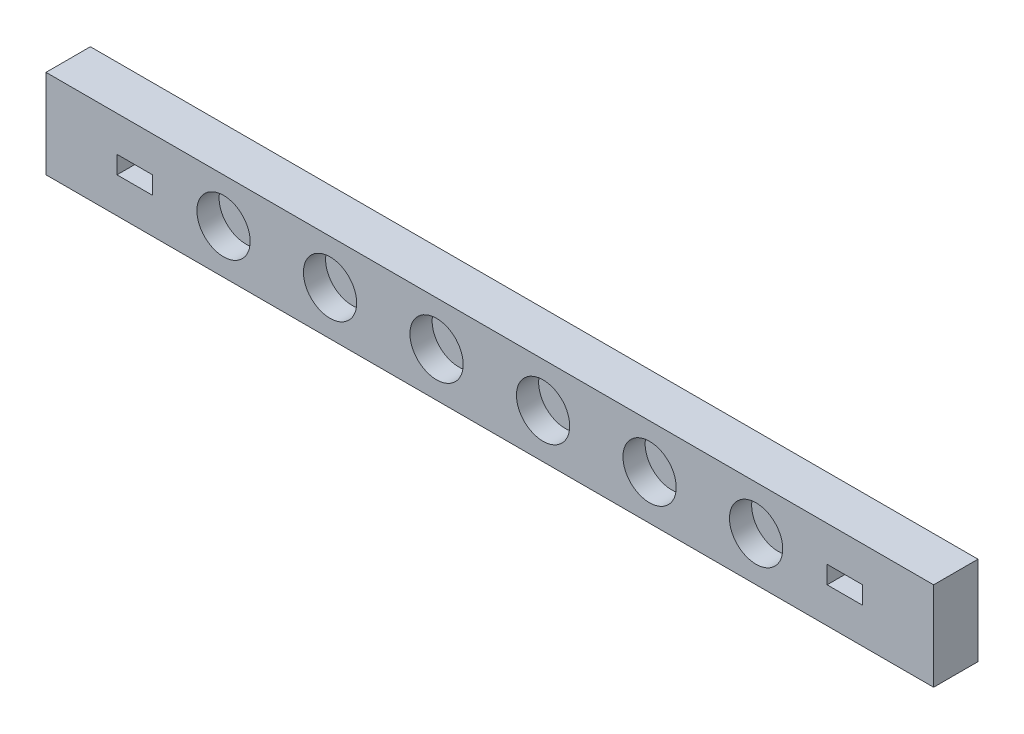
ISO-10303-21;
HEADER;
FILE_DESCRIPTION(('STEP AP214'),'2;1');
FILE_NAME('part.step','',(''),(''),'','','');
FILE_SCHEMA(('AUTOMOTIVE_DESIGN { 1 0 10303 214 1 1 1 1 }'));
ENDSEC;
DATA;
#1=APPLICATION_CONTEXT('core data for automotive mechanical design processes');
#2=APPLICATION_PROTOCOL_DEFINITION('international standard','automotive_design',2000,#1);
#3=PRODUCT_CONTEXT('',#1,'mechanical');
#4=PRODUCT('Part','Part','',(#3));
#5=PRODUCT_RELATED_PRODUCT_CATEGORY('part','',(#4));
#6=PRODUCT_DEFINITION_FORMATION('','',#4);
#7=PRODUCT_DEFINITION_CONTEXT('part definition',#1,'design');
#8=PRODUCT_DEFINITION('design','',#6,#7);
#9=PRODUCT_DEFINITION_SHAPE('','',#8);
#10=(LENGTH_UNIT() NAMED_UNIT(*) SI_UNIT(.MILLI.,.METRE.));
#11=(NAMED_UNIT(*) PLANE_ANGLE_UNIT() SI_UNIT($,.RADIAN.));
#12=(NAMED_UNIT(*) SI_UNIT($,.STERADIAN.) SOLID_ANGLE_UNIT());
#13=UNCERTAINTY_MEASURE_WITH_UNIT(LENGTH_MEASURE(1.E-05),#10,'distance_accuracy_value','');
#14=(GEOMETRIC_REPRESENTATION_CONTEXT(3) GLOBAL_UNCERTAINTY_ASSIGNED_CONTEXT((#13)) GLOBAL_UNIT_ASSIGNED_CONTEXT((#10,
#11,#12)) REPRESENTATION_CONTEXT('',''));
#15=CARTESIAN_POINT('',(0.,0.,0.));
#16=DIRECTION('',(0.,0.,1.));
#17=DIRECTION('',(1.,0.,0.));
#18=AXIS2_PLACEMENT_3D('',#15,#16,#17);
#19=CARTESIAN_POINT('',(0.,0.,50.));
#20=DIRECTION('',(0.,0.,1.));
#21=DIRECTION('',(1.,0.,0.));
#22=AXIS2_PLACEMENT_3D('',#19,#20,#21);
#23=PLANE('',#22);
#24=CARTESIAN_POINT('',(-180.,0.,50.));
#25=DIRECTION('',(0.,0.,1.));
#26=DIRECTION('',(1.,0.,0.));
#27=AXIS2_PLACEMENT_3D('',#24,#25,#26);
#28=CIRCLE('',#27,30.0000000000001);
#29=CARTESIAN_POINT('',(-150.,0.,50.));
#30=VERTEX_POINT('',#29);
#31=EDGE_CURVE('E223',#30,#30,#28,.T.);
#32=ORIENTED_EDGE('',*,*,#31,.F.);
#33=EDGE_LOOP('',(#32));
#34=FACE_BOUND('',#33,.T.);
#35=CARTESIAN_POINT('',(-60.0000000000002,0.,50.));
#36=DIRECTION('',(0.,0.,1.));
#37=DIRECTION('',(1.,0.,0.));
#38=AXIS2_PLACEMENT_3D('',#35,#36,#37);
#39=CIRCLE('',#38,30.0000000000001);
#40=CARTESIAN_POINT('',(-30.0000000000001,0.,50.));
#41=VERTEX_POINT('',#40);
#42=EDGE_CURVE('E230',#41,#41,#39,.T.);
#43=ORIENTED_EDGE('',*,*,#42,.F.);
#44=EDGE_LOOP('',(#43));
#45=FACE_BOUND('',#44,.T.);
#46=CARTESIAN_POINT('',(59.9999999999998,0.,50.));
#47=DIRECTION('',(0.,0.,1.));
#48=DIRECTION('',(1.,0.,0.));
#49=AXIS2_PLACEMENT_3D('',#46,#47,#48);
#50=CIRCLE('',#49,30.0000000000001);
#51=CARTESIAN_POINT('',(89.9999999999999,0.,50.));
#52=VERTEX_POINT('',#51);
#53=EDGE_CURVE('E236',#52,#52,#50,.T.);
#54=ORIENTED_EDGE('',*,*,#53,.F.);
#55=EDGE_LOOP('',(#54));
#56=FACE_BOUND('',#55,.T.);
#57=CARTESIAN_POINT('',(180.,0.,50.));
#58=DIRECTION('',(0.,0.,1.));
#59=DIRECTION('',(1.,0.,0.));
#60=AXIS2_PLACEMENT_3D('',#57,#58,#59);
#61=CIRCLE('',#60,30.0000000000001);
#62=CARTESIAN_POINT('',(210.,0.,50.));
#63=VERTEX_POINT('',#62);
#64=EDGE_CURVE('E242',#63,#63,#61,.T.);
#65=ORIENTED_EDGE('',*,*,#64,.F.);
#66=EDGE_LOOP('',(#65));
#67=FACE_BOUND('',#66,.T.);
#68=CARTESIAN_POINT('',(300.,0.,50.));
#69=DIRECTION('',(0.,0.,1.));
#70=DIRECTION('',(1.,0.,0.));
#71=AXIS2_PLACEMENT_3D('',#68,#69,#70);
#72=CIRCLE('',#71,30.);
#73=CARTESIAN_POINT('',(330.,0.,50.));
#74=VERTEX_POINT('',#73);
#75=EDGE_CURVE('E161',#74,#74,#72,.T.);
#76=ORIENTED_EDGE('',*,*,#75,.F.);
#77=EDGE_LOOP('',(#76));
#78=FACE_BOUND('',#77,.T.);
#79=DIRECTION('',(1.,0.,0.));
#80=VECTOR('',#79,1.);
#81=CARTESIAN_POINT('',(-420.,-9.9999999999999,50.));
#82=LINE('',#81,#80);
#83=CARTESIAN_POINT('',(-420.,-9.9999999999999,50.));
#84=VERTEX_POINT('',#83);
#85=CARTESIAN_POINT('',(-380.,-9.9999999999999,50.));
#86=VERTEX_POINT('',#85);
#87=EDGE_CURVE('E58',#84,#86,#82,.T.);
#88=ORIENTED_EDGE('',*,*,#87,.F.);
#89=DIRECTION('',(0.,-1.,0.));
#90=VECTOR('',#89,1.);
#91=CARTESIAN_POINT('',(-420.,10.0000000000001,50.));
#92=LINE('',#91,#90);
#93=CARTESIAN_POINT('',(-420.,10.0000000000001,50.));
#94=VERTEX_POINT('',#93);
#95=EDGE_CURVE('E204',#94,#84,#92,.T.);
#96=ORIENTED_EDGE('',*,*,#95,.F.);
#97=DIRECTION('',(1.,0.,0.));
#98=VECTOR('',#97,1.);
#99=CARTESIAN_POINT('',(-420.,10.0000000000001,50.));
#100=LINE('',#99,#98);
#101=CARTESIAN_POINT('',(-380.,10.0000000000001,50.));
#102=VERTEX_POINT('',#101);
#103=EDGE_CURVE('E207',#94,#102,#100,.T.);
#104=ORIENTED_EDGE('',*,*,#103,.T.);
#105=DIRECTION('',(0.,-1.,0.));
#106=VECTOR('',#105,1.);
#107=CARTESIAN_POINT('',(-380.,10.0000000000001,50.));
#108=LINE('',#107,#106);
#109=EDGE_CURVE('E211',#102,#86,#108,.T.);
#110=ORIENTED_EDGE('',*,*,#109,.T.);
#111=EDGE_LOOP('',(#88,#96,#104,#110));
#112=FACE_BOUND('',#111,.T.);
#113=CARTESIAN_POINT('',(-300.,0.,50.));
#114=DIRECTION('',(0.,0.,1.));
#115=DIRECTION('',(1.,0.,0.));
#116=AXIS2_PLACEMENT_3D('',#113,#114,#115);
#117=CIRCLE('',#116,30.);
#118=CARTESIAN_POINT('',(-270.,0.,50.));
#119=VERTEX_POINT('',#118);
#120=EDGE_CURVE('E226',#119,#119,#117,.T.);
#121=ORIENTED_EDGE('',*,*,#120,.F.);
#122=EDGE_LOOP('',(#121));
#123=FACE_BOUND('',#122,.T.);
#124=DIRECTION('',(1.,0.,0.));
#125=VECTOR('',#124,1.);
#126=CARTESIAN_POINT('',(-450.,-50.,50.));
#127=LINE('',#126,#125);
#128=CARTESIAN_POINT('',(-500.,-50.,50.));
#129=VERTEX_POINT('',#128);
#130=CARTESIAN_POINT('',(500.,-50.,50.));
#131=VERTEX_POINT('',#130);
#132=EDGE_CURVE('E11',#129,#131,#127,.T.);
#133=ORIENTED_EDGE('',*,*,#132,.T.);
#134=DIRECTION('',(0.,1.,0.));
#135=VECTOR('',#134,1.);
#136=CARTESIAN_POINT('',(500.,-50.,50.));
#137=LINE('',#136,#135);
#138=CARTESIAN_POINT('',(500.,50.,50.));
#139=VERTEX_POINT('',#138);
#140=EDGE_CURVE('E154',#131,#139,#137,.T.);
#141=ORIENTED_EDGE('',*,*,#140,.T.);
#142=DIRECTION('',(-1.,0.,0.));
#143=VECTOR('',#142,1.);
#144=CARTESIAN_POINT('',(-450.,50.,50.));
#145=LINE('',#144,#143);
#146=CARTESIAN_POINT('',(-500.,50.,50.));
#147=VERTEX_POINT('',#146);
#148=EDGE_CURVE('E42',#139,#147,#145,.T.);
#149=ORIENTED_EDGE('',*,*,#148,.T.);
#150=DIRECTION('',(0.,1.,0.));
#151=VECTOR('',#150,1.);
#152=CARTESIAN_POINT('',(-500.,-50.,50.));
#153=LINE('',#152,#151);
#154=EDGE_CURVE('E143',#129,#147,#153,.T.);
#155=ORIENTED_EDGE('',*,*,#154,.F.);
#156=EDGE_LOOP('',(#133,#141,#149,#155));
#157=FACE_BOUND('',#156,.T.);
#158=DIRECTION('',(0.,-1.,0.));
#159=VECTOR('',#158,1.);
#160=CARTESIAN_POINT('',(420.,0.,50.));
#161=LINE('',#160,#159);
#162=CARTESIAN_POINT('',(420.,10.0000000000002,50.));
#163=VERTEX_POINT('',#162);
#164=CARTESIAN_POINT('',(420.,-9.9999999999998,50.));
#165=VERTEX_POINT('',#164);
#166=EDGE_CURVE('E184',#163,#165,#161,.T.);
#167=ORIENTED_EDGE('',*,*,#166,.T.);
#168=DIRECTION('',(-1.,0.,0.));
#169=VECTOR('',#168,1.);
#170=CARTESIAN_POINT('',(0.,-9.99999999999989,50.));
#171=LINE('',#170,#169);
#172=CARTESIAN_POINT('',(380.,-9.9999999999998,50.));
#173=VERTEX_POINT('',#172);
#174=EDGE_CURVE('E50',#165,#173,#171,.T.);
#175=ORIENTED_EDGE('',*,*,#174,.T.);
#176=DIRECTION('',(0.,-1.,0.));
#177=VECTOR('',#176,1.);
#178=CARTESIAN_POINT('',(380.,0.,50.));
#179=LINE('',#178,#177);
#180=CARTESIAN_POINT('',(380.,10.0000000000002,50.));
#181=VERTEX_POINT('',#180);
#182=EDGE_CURVE('E177',#181,#173,#179,.T.);
#183=ORIENTED_EDGE('',*,*,#182,.F.);
#184=DIRECTION('',(-1.,0.,0.));
#185=VECTOR('',#184,1.);
#186=CARTESIAN_POINT('',(0.,10.0000000000001,50.));
#187=LINE('',#186,#185);
#188=EDGE_CURVE('E180',#163,#181,#187,.T.);
#189=ORIENTED_EDGE('',*,*,#188,.F.);
#190=EDGE_LOOP('',(#167,#175,#183,#189));
#191=FACE_BOUND('',#190,.T.);
#192=ADVANCED_FACE('F33',(#34,#45,#56,#67,#78,#112,#123,#157,#191),#23,.T.);
#193=CARTESIAN_POINT('',(-450.,50.,50.));
#194=DIRECTION('',(0.,-1.,0.));
#195=DIRECTION('',(0.,0.,-1.));
#196=AXIS2_PLACEMENT_3D('',#193,#194,#195);
#197=PLANE('',#196);
#198=DIRECTION('',(-1.,0.,0.));
#199=VECTOR('',#198,1.);
#200=CARTESIAN_POINT('',(-450.,50.,0.));
#201=LINE('',#200,#199);
#202=CARTESIAN_POINT('',(500.,50.,0.));
#203=VERTEX_POINT('',#202);
#204=CARTESIAN_POINT('',(-500.,50.,0.));
#205=VERTEX_POINT('',#204);
#206=EDGE_CURVE('E135',#203,#205,#201,.T.);
#207=ORIENTED_EDGE('',*,*,#206,.T.);
#208=DIRECTION('',(0.,0.,1.));
#209=VECTOR('',#208,1.);
#210=CARTESIAN_POINT('',(-500.,50.,0.));
#211=LINE('',#210,#209);
#212=EDGE_CURVE('E142',#205,#147,#211,.T.);
#213=ORIENTED_EDGE('',*,*,#212,.T.);
#214=ORIENTED_EDGE('',*,*,#148,.F.);
#215=DIRECTION('',(0.,0.,-1.));
#216=VECTOR('',#215,1.);
#217=CARTESIAN_POINT('',(500.,50.,0.));
#218=LINE('',#217,#216);
#219=EDGE_CURVE('E150',#139,#203,#218,.T.);
#220=ORIENTED_EDGE('',*,*,#219,.T.);
#221=EDGE_LOOP('',(#207,#213,#214,#220));
#222=FACE_BOUND('',#221,.T.);
#223=ADVANCED_FACE('F35',(#222),#197,.F.);
#224=CARTESIAN_POINT('',(-450.,-50.,50.));
#225=DIRECTION('',(0.,1.,0.));
#226=DIRECTION('',(0.,0.,1.));
#227=AXIS2_PLACEMENT_3D('',#224,#225,#226);
#228=PLANE('',#227);
#229=DIRECTION('',(1.,0.,0.));
#230=VECTOR('',#229,1.);
#231=CARTESIAN_POINT('',(-450.,-50.,0.));
#232=LINE('',#231,#230);
#233=CARTESIAN_POINT('',(-500.,-50.,0.));
#234=VERTEX_POINT('',#233);
#235=CARTESIAN_POINT('',(500.,-50.,0.));
#236=VERTEX_POINT('',#235);
#237=EDGE_CURVE('E37',#234,#236,#232,.T.);
#238=ORIENTED_EDGE('',*,*,#237,.T.);
#239=DIRECTION('',(0.,0.,-1.));
#240=VECTOR('',#239,1.);
#241=CARTESIAN_POINT('',(500.,-50.,0.));
#242=LINE('',#241,#240);
#243=EDGE_CURVE('E152',#131,#236,#242,.T.);
#244=ORIENTED_EDGE('',*,*,#243,.F.);
#245=ORIENTED_EDGE('',*,*,#132,.F.);
#246=DIRECTION('',(0.,0.,1.));
#247=VECTOR('',#246,1.);
#248=CARTESIAN_POINT('',(-500.,-50.,0.));
#249=LINE('',#248,#247);
#250=EDGE_CURVE('E140',#234,#129,#249,.T.);
#251=ORIENTED_EDGE('',*,*,#250,.F.);
#252=EDGE_LOOP('',(#238,#244,#245,#251));
#253=FACE_BOUND('',#252,.T.);
#254=ADVANCED_FACE('F145',(#253),#228,.F.);
#255=CARTESIAN_POINT('',(0.,0.,0.));
#256=DIRECTION('',(0.,0.,1.));
#257=DIRECTION('',(1.,0.,0.));
#258=AXIS2_PLACEMENT_3D('',#255,#256,#257);
#259=PLANE('',#258);
#260=ORIENTED_EDGE('',*,*,#206,.F.);
#261=DIRECTION('',(0.,1.,0.));
#262=VECTOR('',#261,1.);
#263=CARTESIAN_POINT('',(500.,-50.,0.));
#264=LINE('',#263,#262);
#265=EDGE_CURVE('E130',#236,#203,#264,.T.);
#266=ORIENTED_EDGE('',*,*,#265,.F.);
#267=ORIENTED_EDGE('',*,*,#237,.F.);
#268=DIRECTION('',(0.,1.,0.));
#269=VECTOR('',#268,1.);
#270=CARTESIAN_POINT('',(-500.,-50.,0.));
#271=LINE('',#270,#269);
#272=EDGE_CURVE('E127',#234,#205,#271,.T.);
#273=ORIENTED_EDGE('',*,*,#272,.T.);
#274=EDGE_LOOP('',(#260,#266,#267,#273));
#275=FACE_BOUND('',#274,.T.);
#276=ADVANCED_FACE('F126',(#275),#259,.F.);
#277=CARTESIAN_POINT('',(-300.,0.,25.));
#278=DIRECTION('',(0.,0.,1.));
#279=DIRECTION('',(1.,0.,0.));
#280=AXIS2_PLACEMENT_3D('',#277,#278,#279);
#281=CYLINDRICAL_SURFACE('',#280,30.);
#282=CARTESIAN_POINT('',(-300.,0.,25.));
#283=DIRECTION('',(0.,0.,1.));
#284=DIRECTION('',(1.,0.,0.));
#285=AXIS2_PLACEMENT_3D('',#282,#283,#284);
#286=CIRCLE('',#285,30.);
#287=CARTESIAN_POINT('',(-270.,0.,25.));
#288=VERTEX_POINT('',#287);
#289=EDGE_CURVE('E247',#288,#288,#286,.T.);
#290=ORIENTED_EDGE('',*,*,#289,.F.);
#291=EDGE_LOOP('',(#290));
#292=FACE_BOUND('',#291,.T.);
#293=ORIENTED_EDGE('',*,*,#120,.T.);
#294=EDGE_LOOP('',(#293));
#295=FACE_BOUND('',#294,.T.);
#296=ADVANCED_FACE('F347',(#292,#295),#281,.F.);
#297=CARTESIAN_POINT('',(0.,0.,25.));
#298=DIRECTION('',(0.,0.,1.));
#299=DIRECTION('',(1.,0.,0.));
#300=AXIS2_PLACEMENT_3D('',#297,#298,#299);
#301=PLANE('',#300);
#302=ORIENTED_EDGE('',*,*,#289,.T.);
#303=EDGE_LOOP('',(#302));
#304=FACE_BOUND('',#303,.T.);
#305=ADVANCED_FACE('F296',(#304),#301,.T.);
#306=CARTESIAN_POINT('',(-420.,-9.9999999999999,25.));
#307=DIRECTION('',(0.,-1.,0.));
#308=DIRECTION('',(0.,0.,-1.));
#309=AXIS2_PLACEMENT_3D('',#306,#307,#308);
#310=PLANE('',#309);
#311=ORIENTED_EDGE('',*,*,#87,.T.);
#312=DIRECTION('',(0.,0.,1.));
#313=VECTOR('',#312,1.);
#314=CARTESIAN_POINT('',(-380.,-9.9999999999999,25.));
#315=LINE('',#314,#313);
#316=CARTESIAN_POINT('',(-380.,-9.9999999999999,25.));
#317=VERTEX_POINT('',#316);
#318=EDGE_CURVE('E196',#317,#86,#315,.T.);
#319=ORIENTED_EDGE('',*,*,#318,.F.);
#320=DIRECTION('',(1.,0.,0.));
#321=VECTOR('',#320,1.);
#322=CARTESIAN_POINT('',(-420.,-9.9999999999999,25.));
#323=LINE('',#322,#321);
#324=CARTESIAN_POINT('',(-420.,-9.9999999999999,25.));
#325=VERTEX_POINT('',#324);
#326=EDGE_CURVE('E208',#325,#317,#323,.T.);
#327=ORIENTED_EDGE('',*,*,#326,.F.);
#328=DIRECTION('',(0.,0.,1.));
#329=VECTOR('',#328,1.);
#330=CARTESIAN_POINT('',(-420.,-9.9999999999999,25.));
#331=LINE('',#330,#329);
#332=EDGE_CURVE('E158',#325,#84,#331,.T.);
#333=ORIENTED_EDGE('',*,*,#332,.T.);
#334=EDGE_LOOP('',(#311,#319,#327,#333));
#335=FACE_BOUND('',#334,.T.);
#336=ADVANCED_FACE('F292',(#335),#310,.F.);
#337=CARTESIAN_POINT('',(-420.,10.0000000000001,25.));
#338=DIRECTION('',(-1.,0.,0.));
#339=DIRECTION('',(0.,0.,1.));
#340=AXIS2_PLACEMENT_3D('',#337,#338,#339);
#341=PLANE('',#340);
#342=ORIENTED_EDGE('',*,*,#95,.T.);
#343=ORIENTED_EDGE('',*,*,#332,.F.);
#344=DIRECTION('',(0.,-1.,0.));
#345=VECTOR('',#344,1.);
#346=CARTESIAN_POINT('',(-420.,10.0000000000001,25.));
#347=LINE('',#346,#345);
#348=CARTESIAN_POINT('',(-420.,10.0000000000001,25.));
#349=VERTEX_POINT('',#348);
#350=EDGE_CURVE('E198',#349,#325,#347,.T.);
#351=ORIENTED_EDGE('',*,*,#350,.F.);
#352=DIRECTION('',(0.,0.,1.));
#353=VECTOR('',#352,1.);
#354=CARTESIAN_POINT('',(-420.,10.0000000000001,25.));
#355=LINE('',#354,#353);
#356=EDGE_CURVE('E201',#349,#94,#355,.T.);
#357=ORIENTED_EDGE('',*,*,#356,.T.);
#358=EDGE_LOOP('',(#342,#343,#351,#357));
#359=FACE_BOUND('',#358,.T.);
#360=ADVANCED_FACE('F295',(#359),#341,.F.);
#361=CARTESIAN_POINT('',(-420.,10.0000000000001,25.));
#362=DIRECTION('',(0.,-1.,0.));
#363=DIRECTION('',(1.,0.,0.));
#364=AXIS2_PLACEMENT_3D('',#361,#362,#363);
#365=PLANE('',#364);
#366=ORIENTED_EDGE('',*,*,#103,.F.);
#367=ORIENTED_EDGE('',*,*,#356,.F.);
#368=DIRECTION('',(1.,0.,0.));
#369=VECTOR('',#368,1.);
#370=CARTESIAN_POINT('',(-420.,10.0000000000001,25.));
#371=LINE('',#370,#369);
#372=CARTESIAN_POINT('',(-380.,10.0000000000001,25.));
#373=VERTEX_POINT('',#372);
#374=EDGE_CURVE('E217',#349,#373,#371,.T.);
#375=ORIENTED_EDGE('',*,*,#374,.T.);
#376=DIRECTION('',(0.,0.,1.));
#377=VECTOR('',#376,1.);
#378=CARTESIAN_POINT('',(-380.,10.0000000000001,25.));
#379=LINE('',#378,#377);
#380=EDGE_CURVE('E199',#373,#102,#379,.T.);
#381=ORIENTED_EDGE('',*,*,#380,.T.);
#382=EDGE_LOOP('',(#366,#367,#375,#381));
#383=FACE_BOUND('',#382,.T.);
#384=ADVANCED_FACE('F301',(#383),#365,.T.);
#385=CARTESIAN_POINT('',(-380.,10.0000000000001,25.));
#386=DIRECTION('',(-1.,0.,0.));
#387=DIRECTION('',(0.,0.,1.));
#388=AXIS2_PLACEMENT_3D('',#385,#386,#387);
#389=PLANE('',#388);
#390=ORIENTED_EDGE('',*,*,#109,.F.);
#391=ORIENTED_EDGE('',*,*,#380,.F.);
#392=DIRECTION('',(0.,-1.,0.));
#393=VECTOR('',#392,1.);
#394=CARTESIAN_POINT('',(-380.,10.0000000000001,25.));
#395=LINE('',#394,#393);
#396=EDGE_CURVE('E219',#373,#317,#395,.T.);
#397=ORIENTED_EDGE('',*,*,#396,.T.);
#398=ORIENTED_EDGE('',*,*,#318,.T.);
#399=EDGE_LOOP('',(#390,#391,#397,#398));
#400=FACE_BOUND('',#399,.T.);
#401=ADVANCED_FACE('F297',(#400),#389,.T.);
#402=CARTESIAN_POINT('',(0.,0.,25.));
#403=DIRECTION('',(0.,0.,-1.));
#404=DIRECTION('',(-1.,0.,0.));
#405=AXIS2_PLACEMENT_3D('',#402,#403,#404);
#406=PLANE('',#405);
#407=ORIENTED_EDGE('',*,*,#326,.T.);
#408=ORIENTED_EDGE('',*,*,#396,.F.);
#409=ORIENTED_EDGE('',*,*,#374,.F.);
#410=ORIENTED_EDGE('',*,*,#350,.T.);
#411=EDGE_LOOP('',(#407,#408,#409,#410));
#412=FACE_BOUND('',#411,.T.);
#413=ADVANCED_FACE('F300',(#412),#406,.F.);
#414=CARTESIAN_POINT('',(0.,-9.99999999999989,25.));
#415=DIRECTION('',(0.,1.,0.));
#416=DIRECTION('',(-1.,0.,0.));
#417=AXIS2_PLACEMENT_3D('',#414,#415,#416);
#418=PLANE('',#417);
#419=ORIENTED_EDGE('',*,*,#174,.F.);
#420=DIRECTION('',(0.,0.,1.));
#421=VECTOR('',#420,1.);
#422=CARTESIAN_POINT('',(420.,-9.9999999999998,25.));
#423=LINE('',#422,#421);
#424=CARTESIAN_POINT('',(420.,-9.9999999999998,25.));
#425=VERTEX_POINT('',#424);
#426=EDGE_CURVE('E168',#425,#165,#423,.T.);
#427=ORIENTED_EDGE('',*,*,#426,.F.);
#428=DIRECTION('',(-1.,0.,0.));
#429=VECTOR('',#428,1.);
#430=CARTESIAN_POINT('',(0.,-9.99999999999989,25.));
#431=LINE('',#430,#429);
#432=CARTESIAN_POINT('',(380.,-9.9999999999998,25.));
#433=VERTEX_POINT('',#432);
#434=EDGE_CURVE('E181',#425,#433,#431,.T.);
#435=ORIENTED_EDGE('',*,*,#434,.T.);
#436=DIRECTION('',(0.,0.,1.));
#437=VECTOR('',#436,1.);
#438=CARTESIAN_POINT('',(380.,-9.9999999999998,25.));
#439=LINE('',#438,#437);
#440=EDGE_CURVE('E175',#433,#173,#439,.T.);
#441=ORIENTED_EDGE('',*,*,#440,.T.);
#442=EDGE_LOOP('',(#419,#427,#435,#441));
#443=FACE_BOUND('',#442,.T.);
#444=ADVANCED_FACE('F269',(#443),#418,.T.);
#445=CARTESIAN_POINT('',(380.,0.,25.));
#446=DIRECTION('',(-1.,0.,0.));
#447=DIRECTION('',(0.,0.,1.));
#448=AXIS2_PLACEMENT_3D('',#445,#446,#447);
#449=PLANE('',#448);
#450=ORIENTED_EDGE('',*,*,#182,.T.);
#451=ORIENTED_EDGE('',*,*,#440,.F.);
#452=DIRECTION('',(0.,-1.,0.));
#453=VECTOR('',#452,1.);
#454=CARTESIAN_POINT('',(380.,0.,25.));
#455=LINE('',#454,#453);
#456=CARTESIAN_POINT('',(380.,10.0000000000002,25.));
#457=VERTEX_POINT('',#456);
#458=EDGE_CURVE('E170',#457,#433,#455,.T.);
#459=ORIENTED_EDGE('',*,*,#458,.F.);
#460=DIRECTION('',(0.,0.,1.));
#461=VECTOR('',#460,1.);
#462=CARTESIAN_POINT('',(380.,10.0000000000002,25.));
#463=LINE('',#462,#461);
#464=EDGE_CURVE('E173',#457,#181,#463,.T.);
#465=ORIENTED_EDGE('',*,*,#464,.T.);
#466=EDGE_LOOP('',(#450,#451,#459,#465));
#467=FACE_BOUND('',#466,.T.);
#468=ADVANCED_FACE('F276',(#467),#449,.F.);
#469=CARTESIAN_POINT('',(0.,10.0000000000001,25.));
#470=DIRECTION('',(0.,1.,0.));
#471=DIRECTION('',(-1.,0.,0.));
#472=AXIS2_PLACEMENT_3D('',#469,#470,#471);
#473=PLANE('',#472);
#474=ORIENTED_EDGE('',*,*,#188,.T.);
#475=ORIENTED_EDGE('',*,*,#464,.F.);
#476=DIRECTION('',(-1.,0.,0.));
#477=VECTOR('',#476,1.);
#478=CARTESIAN_POINT('',(0.,10.0000000000001,25.));
#479=LINE('',#478,#477);
#480=CARTESIAN_POINT('',(420.,10.0000000000002,25.));
#481=VERTEX_POINT('',#480);
#482=EDGE_CURVE('E190',#481,#457,#479,.T.);
#483=ORIENTED_EDGE('',*,*,#482,.F.);
#484=DIRECTION('',(0.,0.,1.));
#485=VECTOR('',#484,1.);
#486=CARTESIAN_POINT('',(420.,10.0000000000002,25.));
#487=LINE('',#486,#485);
#488=EDGE_CURVE('E171',#481,#163,#487,.T.);
#489=ORIENTED_EDGE('',*,*,#488,.T.);
#490=EDGE_LOOP('',(#474,#475,#483,#489));
#491=FACE_BOUND('',#490,.T.);
#492=ADVANCED_FACE('F278',(#491),#473,.F.);
#493=CARTESIAN_POINT('',(420.,0.,25.));
#494=DIRECTION('',(-1.,0.,0.));
#495=DIRECTION('',(0.,0.,1.));
#496=AXIS2_PLACEMENT_3D('',#493,#494,#495);
#497=PLANE('',#496);
#498=ORIENTED_EDGE('',*,*,#166,.F.);
#499=ORIENTED_EDGE('',*,*,#488,.F.);
#500=DIRECTION('',(0.,-1.,0.));
#501=VECTOR('',#500,1.);
#502=CARTESIAN_POINT('',(420.,0.,25.));
#503=LINE('',#502,#501);
#504=EDGE_CURVE('E193',#481,#425,#503,.T.);
#505=ORIENTED_EDGE('',*,*,#504,.T.);
#506=ORIENTED_EDGE('',*,*,#426,.T.);
#507=EDGE_LOOP('',(#498,#499,#505,#506));
#508=FACE_BOUND('',#507,.T.);
#509=ADVANCED_FACE('F266',(#508),#497,.T.);
#510=CARTESIAN_POINT('',(0.,0.,25.));
#511=DIRECTION('',(0.,0.,1.));
#512=DIRECTION('',(1.,0.,0.));
#513=AXIS2_PLACEMENT_3D('',#510,#511,#512);
#514=PLANE('',#513);
#515=ORIENTED_EDGE('',*,*,#434,.F.);
#516=ORIENTED_EDGE('',*,*,#504,.F.);
#517=ORIENTED_EDGE('',*,*,#482,.T.);
#518=ORIENTED_EDGE('',*,*,#458,.T.);
#519=EDGE_LOOP('',(#515,#516,#517,#518));
#520=FACE_BOUND('',#519,.T.);
#521=ADVANCED_FACE('F272',(#520),#514,.T.);
#522=CARTESIAN_POINT('',(300.,0.,25.));
#523=DIRECTION('',(0.,0.,1.));
#524=DIRECTION('',(1.,0.,0.));
#525=AXIS2_PLACEMENT_3D('',#522,#523,#524);
#526=CYLINDRICAL_SURFACE('',#525,30.);
#527=CARTESIAN_POINT('',(300.,0.,25.));
#528=DIRECTION('',(0.,0.,1.));
#529=DIRECTION('',(1.,0.,0.));
#530=AXIS2_PLACEMENT_3D('',#527,#528,#529);
#531=CIRCLE('',#530,30.);
#532=CARTESIAN_POINT('',(330.,0.,25.));
#533=VERTEX_POINT('',#532);
#534=EDGE_CURVE('E165',#533,#533,#531,.T.);
#535=ORIENTED_EDGE('',*,*,#534,.F.);
#536=EDGE_LOOP('',(#535));
#537=FACE_BOUND('',#536,.T.);
#538=ORIENTED_EDGE('',*,*,#75,.T.);
#539=EDGE_LOOP('',(#538));
#540=FACE_BOUND('',#539,.T.);
#541=ADVANCED_FACE('F291',(#537,#540),#526,.F.);
#542=CARTESIAN_POINT('',(0.,0.,25.));
#543=DIRECTION('',(0.,0.,1.));
#544=DIRECTION('',(1.,0.,0.));
#545=AXIS2_PLACEMENT_3D('',#542,#543,#544);
#546=PLANE('',#545);
#547=ORIENTED_EDGE('',*,*,#534,.T.);
#548=EDGE_LOOP('',(#547));
#549=FACE_BOUND('',#548,.T.);
#550=ADVANCED_FACE('F340',(#549),#546,.T.);
#551=CARTESIAN_POINT('',(180.,0.,25.));
#552=DIRECTION('',(0.,0.,1.));
#553=DIRECTION('',(1.,0.,0.));
#554=AXIS2_PLACEMENT_3D('',#551,#552,#553);
#555=CYLINDRICAL_SURFACE('',#554,30.0000000000001);
#556=CARTESIAN_POINT('',(180.,0.,25.));
#557=DIRECTION('',(0.,0.,1.));
#558=DIRECTION('',(1.,0.,0.));
#559=AXIS2_PLACEMENT_3D('',#556,#557,#558);
#560=CIRCLE('',#559,30.0000000000001);
#561=CARTESIAN_POINT('',(210.,0.,25.));
#562=VERTEX_POINT('',#561);
#563=EDGE_CURVE('E164',#562,#562,#560,.T.);
#564=ORIENTED_EDGE('',*,*,#563,.F.);
#565=EDGE_LOOP('',(#564));
#566=FACE_BOUND('',#565,.T.);
#567=ORIENTED_EDGE('',*,*,#64,.T.);
#568=EDGE_LOOP('',(#567));
#569=FACE_BOUND('',#568,.T.);
#570=ADVANCED_FACE('F337',(#566,#569),#555,.F.);
#571=CARTESIAN_POINT('',(0.,0.,25.));
#572=DIRECTION('',(0.,0.,1.));
#573=DIRECTION('',(1.,0.,0.));
#574=AXIS2_PLACEMENT_3D('',#571,#572,#573);
#575=PLANE('',#574);
#576=ORIENTED_EDGE('',*,*,#563,.T.);
#577=EDGE_LOOP('',(#576));
#578=FACE_BOUND('',#577,.T.);
#579=ADVANCED_FACE('F332',(#578),#575,.T.);
#580=CARTESIAN_POINT('',(59.9999999999998,0.,25.));
#581=DIRECTION('',(0.,0.,1.));
#582=DIRECTION('',(1.,0.,0.));
#583=AXIS2_PLACEMENT_3D('',#580,#581,#582);
#584=CYLINDRICAL_SURFACE('',#583,30.0000000000001);
#585=CARTESIAN_POINT('',(59.9999999999998,0.,25.));
#586=DIRECTION('',(0.,0.,1.));
#587=DIRECTION('',(1.,0.,0.));
#588=AXIS2_PLACEMENT_3D('',#585,#586,#587);
#589=CIRCLE('',#588,30.0000000000001);
#590=CARTESIAN_POINT('',(89.9999999999999,0.,25.));
#591=VERTEX_POINT('',#590);
#592=EDGE_CURVE('E239',#591,#591,#589,.T.);
#593=ORIENTED_EDGE('',*,*,#592,.F.);
#594=EDGE_LOOP('',(#593));
#595=FACE_BOUND('',#594,.T.);
#596=ORIENTED_EDGE('',*,*,#53,.T.);
#597=EDGE_LOOP('',(#596));
#598=FACE_BOUND('',#597,.T.);
#599=ADVANCED_FACE('F329',(#595,#598),#584,.F.);
#600=CARTESIAN_POINT('',(0.,0.,25.));
#601=DIRECTION('',(0.,0.,1.));
#602=DIRECTION('',(1.,0.,0.));
#603=AXIS2_PLACEMENT_3D('',#600,#601,#602);
#604=PLANE('',#603);
#605=ORIENTED_EDGE('',*,*,#592,.T.);
#606=EDGE_LOOP('',(#605));
#607=FACE_BOUND('',#606,.T.);
#608=ADVANCED_FACE('F324',(#607),#604,.T.);
#609=CARTESIAN_POINT('',(-60.0000000000002,0.,25.));
#610=DIRECTION('',(0.,0.,1.));
#611=DIRECTION('',(1.,0.,0.));
#612=AXIS2_PLACEMENT_3D('',#609,#610,#611);
#613=CYLINDRICAL_SURFACE('',#612,30.0000000000001);
#614=CARTESIAN_POINT('',(-60.0000000000002,0.,25.));
#615=DIRECTION('',(0.,0.,1.));
#616=DIRECTION('',(1.,0.,0.));
#617=AXIS2_PLACEMENT_3D('',#614,#615,#616);
#618=CIRCLE('',#617,30.0000000000001);
#619=CARTESIAN_POINT('',(-30.0000000000001,0.,25.));
#620=VERTEX_POINT('',#619);
#621=EDGE_CURVE('E233',#620,#620,#618,.T.);
#622=ORIENTED_EDGE('',*,*,#621,.F.);
#623=EDGE_LOOP('',(#622));
#624=FACE_BOUND('',#623,.T.);
#625=ORIENTED_EDGE('',*,*,#42,.T.);
#626=EDGE_LOOP('',(#625));
#627=FACE_BOUND('',#626,.T.);
#628=ADVANCED_FACE('F321',(#624,#627),#613,.F.);
#629=CARTESIAN_POINT('',(0.,0.,25.));
#630=DIRECTION('',(0.,0.,1.));
#631=DIRECTION('',(1.,0.,0.));
#632=AXIS2_PLACEMENT_3D('',#629,#630,#631);
#633=PLANE('',#632);
#634=ORIENTED_EDGE('',*,*,#621,.T.);
#635=EDGE_LOOP('',(#634));
#636=FACE_BOUND('',#635,.T.);
#637=ADVANCED_FACE('F316',(#636),#633,.T.);
#638=CARTESIAN_POINT('',(-180.,0.,25.));
#639=DIRECTION('',(0.,0.,1.));
#640=DIRECTION('',(1.,0.,0.));
#641=AXIS2_PLACEMENT_3D('',#638,#639,#640);
#642=CYLINDRICAL_SURFACE('',#641,30.0000000000001);
#643=CARTESIAN_POINT('',(-180.,0.,25.));
#644=DIRECTION('',(0.,0.,1.));
#645=DIRECTION('',(1.,0.,0.));
#646=AXIS2_PLACEMENT_3D('',#643,#644,#645);
#647=CIRCLE('',#646,30.0000000000001);
#648=CARTESIAN_POINT('',(-150.,0.,25.));
#649=VERTEX_POINT('',#648);
#650=EDGE_CURVE('E227',#649,#649,#647,.T.);
#651=ORIENTED_EDGE('',*,*,#650,.F.);
#652=EDGE_LOOP('',(#651));
#653=FACE_BOUND('',#652,.T.);
#654=ORIENTED_EDGE('',*,*,#31,.T.);
#655=EDGE_LOOP('',(#654));
#656=FACE_BOUND('',#655,.T.);
#657=ADVANCED_FACE('F312',(#653,#656),#642,.F.);
#658=CARTESIAN_POINT('',(0.,0.,25.));
#659=DIRECTION('',(0.,0.,1.));
#660=DIRECTION('',(1.,0.,0.));
#661=AXIS2_PLACEMENT_3D('',#658,#659,#660);
#662=PLANE('',#661);
#663=ORIENTED_EDGE('',*,*,#650,.T.);
#664=EDGE_LOOP('',(#663));
#665=FACE_BOUND('',#664,.T.);
#666=ADVANCED_FACE('F315',(#665),#662,.T.);
#667=CARTESIAN_POINT('',(500.,-50.,0.));
#668=DIRECTION('',(1.,0.,0.));
#669=DIRECTION('',(0.,0.,-1.));
#670=AXIS2_PLACEMENT_3D('',#667,#668,#669);
#671=PLANE('',#670);
#672=ORIENTED_EDGE('',*,*,#219,.F.);
#673=ORIENTED_EDGE('',*,*,#140,.F.);
#674=ORIENTED_EDGE('',*,*,#243,.T.);
#675=ORIENTED_EDGE('',*,*,#265,.T.);
#676=EDGE_LOOP('',(#672,#673,#674,#675));
#677=FACE_BOUND('',#676,.T.);
#678=ADVANCED_FACE('F255',(#677),#671,.T.);
#679=CARTESIAN_POINT('',(-500.,-50.,0.));
#680=DIRECTION('',(-1.,0.,0.));
#681=DIRECTION('',(0.,0.,1.));
#682=AXIS2_PLACEMENT_3D('',#679,#680,#681);
#683=PLANE('',#682);
#684=ORIENTED_EDGE('',*,*,#212,.F.);
#685=ORIENTED_EDGE('',*,*,#272,.F.);
#686=ORIENTED_EDGE('',*,*,#250,.T.);
#687=ORIENTED_EDGE('',*,*,#154,.T.);
#688=EDGE_LOOP('',(#684,#685,#686,#687));
#689=FACE_BOUND('',#688,.T.);
#690=ADVANCED_FACE('F138',(#689),#683,.T.);
#691=CLOSED_SHELL('',(#192,#223,#254,#276,#296,#305,#336,#360,#384,#401,#413,#444,#468,#492,
#509,#521,#541,#550,#570,#579,#599,#608,#628,#637,#657,#666,#678,#690));
#692=MANIFOLD_SOLID_BREP('B2',#691);
#693=ADVANCED_BREP_SHAPE_REPRESENTATION('',(#18,#692),#14);
#694=SHAPE_DEFINITION_REPRESENTATION(#9,#693);
ENDSEC;
END-ISO-10303-21;
